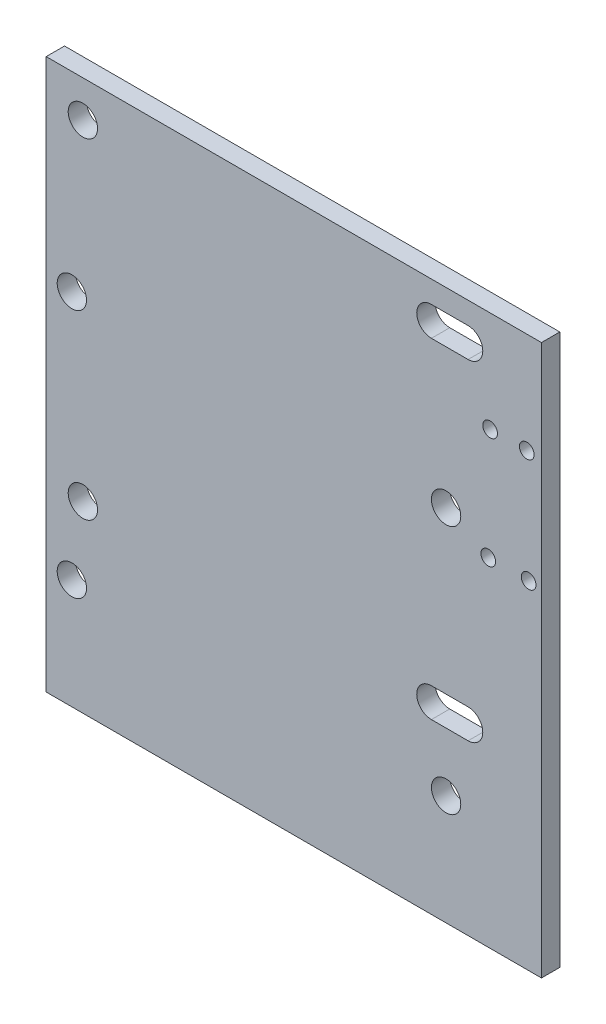
ISO-10303-21;
HEADER;
FILE_DESCRIPTION(('STEP AP214'),'2;1');
FILE_NAME('part.step','',(''),(''),'','','');
FILE_SCHEMA(('AUTOMOTIVE_DESIGN { 1 0 10303 214 1 1 1 1 }'));
ENDSEC;
DATA;
#1=APPLICATION_CONTEXT('core data for automotive mechanical design processes');
#2=APPLICATION_PROTOCOL_DEFINITION('international standard','automotive_design',2000,#1);
#3=PRODUCT_CONTEXT('',#1,'mechanical');
#4=PRODUCT('Part','Part','',(#3));
#5=PRODUCT_RELATED_PRODUCT_CATEGORY('part','',(#4));
#6=PRODUCT_DEFINITION_FORMATION('','',#4);
#7=PRODUCT_DEFINITION_CONTEXT('part definition',#1,'design');
#8=PRODUCT_DEFINITION('design','',#6,#7);
#9=PRODUCT_DEFINITION_SHAPE('','',#8);
#10=(LENGTH_UNIT() NAMED_UNIT(*) SI_UNIT(.MILLI.,.METRE.));
#11=(NAMED_UNIT(*) PLANE_ANGLE_UNIT() SI_UNIT($,.RADIAN.));
#12=(NAMED_UNIT(*) SI_UNIT($,.STERADIAN.) SOLID_ANGLE_UNIT());
#13=UNCERTAINTY_MEASURE_WITH_UNIT(LENGTH_MEASURE(1.E-05),#10,'distance_accuracy_value','');
#14=(GEOMETRIC_REPRESENTATION_CONTEXT(3) GLOBAL_UNCERTAINTY_ASSIGNED_CONTEXT((#13)) GLOBAL_UNIT_ASSIGNED_CONTEXT((#10,
#11,#12)) REPRESENTATION_CONTEXT('',''));
#15=CARTESIAN_POINT('',(0.,0.,0.));
#16=DIRECTION('',(0.,0.,1.));
#17=DIRECTION('',(1.,0.,0.));
#18=AXIS2_PLACEMENT_3D('',#15,#16,#17);
#19=CARTESIAN_POINT('',(67.5,75.,5.));
#20=DIRECTION('',(-1.,0.,0.));
#21=DIRECTION('',(0.,-1.,0.));
#22=AXIS2_PLACEMENT_3D('',#19,#20,#21);
#23=PLANE('',#22);
#24=DIRECTION('',(0.,1.,0.));
#25=VECTOR('',#24,1.);
#26=CARTESIAN_POINT('',(67.5,75.,0.));
#27=LINE('',#26,#25);
#28=CARTESIAN_POINT('',(67.5,-75.,0.));
#29=VERTEX_POINT('',#28);
#30=CARTESIAN_POINT('',(67.5,75.,0.));
#31=VERTEX_POINT('',#30);
#32=EDGE_CURVE('E200',#29,#31,#27,.T.);
#33=ORIENTED_EDGE('',*,*,#32,.T.);
#34=DIRECTION('',(0.,0.,-1.));
#35=VECTOR('',#34,1.);
#36=CARTESIAN_POINT('',(67.5,75.,5.));
#37=LINE('',#36,#35);
#38=CARTESIAN_POINT('',(67.5,75.,5.));
#39=VERTEX_POINT('',#38);
#40=EDGE_CURVE('E11',#39,#31,#37,.T.);
#41=ORIENTED_EDGE('',*,*,#40,.F.);
#42=DIRECTION('',(0.,1.,0.));
#43=VECTOR('',#42,1.);
#44=CARTESIAN_POINT('',(67.5,75.,5.));
#45=LINE('',#44,#43);
#46=CARTESIAN_POINT('',(67.5,-75.,5.));
#47=VERTEX_POINT('',#46);
#48=EDGE_CURVE('E201',#47,#39,#45,.T.);
#49=ORIENTED_EDGE('',*,*,#48,.F.);
#50=DIRECTION('',(0.,0.,-1.));
#51=VECTOR('',#50,1.);
#52=CARTESIAN_POINT('',(67.5,-75.,5.));
#53=LINE('',#52,#51);
#54=EDGE_CURVE('E211',#47,#29,#53,.T.);
#55=ORIENTED_EDGE('',*,*,#54,.T.);
#56=EDGE_LOOP('',(#33,#41,#49,#55));
#57=FACE_BOUND('',#56,.T.);
#58=ADVANCED_FACE('F35',(#57),#23,.F.);
#59=CARTESIAN_POINT('',(-67.5,75.,5.));
#60=DIRECTION('',(0.,-1.,0.));
#61=DIRECTION('',(0.,0.,-1.));
#62=AXIS2_PLACEMENT_3D('',#59,#60,#61);
#63=PLANE('',#62);
#64=DIRECTION('',(-1.,0.,0.));
#65=VECTOR('',#64,1.);
#66=CARTESIAN_POINT('',(-67.5,75.,0.));
#67=LINE('',#66,#65);
#68=CARTESIAN_POINT('',(-67.5,75.,0.));
#69=VERTEX_POINT('',#68);
#70=EDGE_CURVE('E214',#31,#69,#67,.T.);
#71=ORIENTED_EDGE('',*,*,#70,.T.);
#72=DIRECTION('',(0.,0.,-1.));
#73=VECTOR('',#72,1.);
#74=CARTESIAN_POINT('',(-67.5,75.,5.));
#75=LINE('',#74,#73);
#76=CARTESIAN_POINT('',(-67.5,75.,5.));
#77=VERTEX_POINT('',#76);
#78=EDGE_CURVE('E42',#77,#69,#75,.T.);
#79=ORIENTED_EDGE('',*,*,#78,.F.);
#80=DIRECTION('',(-1.,0.,0.));
#81=VECTOR('',#80,1.);
#82=CARTESIAN_POINT('',(-67.5,75.,5.));
#83=LINE('',#82,#81);
#84=EDGE_CURVE('E204',#39,#77,#83,.T.);
#85=ORIENTED_EDGE('',*,*,#84,.F.);
#86=ORIENTED_EDGE('',*,*,#40,.T.);
#87=EDGE_LOOP('',(#71,#79,#85,#86));
#88=FACE_BOUND('',#87,.T.);
#89=ADVANCED_FACE('F243',(#88),#63,.F.);
#90=CARTESIAN_POINT('',(-67.5,75.,5.));
#91=DIRECTION('',(1.,0.,0.));
#92=DIRECTION('',(0.,1.,0.));
#93=AXIS2_PLACEMENT_3D('',#90,#91,#92);
#94=PLANE('',#93);
#95=DIRECTION('',(0.,-1.,0.));
#96=VECTOR('',#95,1.);
#97=CARTESIAN_POINT('',(-67.5,75.,0.));
#98=LINE('',#97,#96);
#99=CARTESIAN_POINT('',(-67.5,-75.,0.));
#100=VERTEX_POINT('',#99);
#101=EDGE_CURVE('E216',#69,#100,#98,.T.);
#102=ORIENTED_EDGE('',*,*,#101,.T.);
#103=DIRECTION('',(0.,0.,-1.));
#104=VECTOR('',#103,1.);
#105=CARTESIAN_POINT('',(-67.5,-75.,5.));
#106=LINE('',#105,#104);
#107=CARTESIAN_POINT('',(-67.5,-75.,5.));
#108=VERTEX_POINT('',#107);
#109=EDGE_CURVE('E221',#108,#100,#106,.T.);
#110=ORIENTED_EDGE('',*,*,#109,.F.);
#111=DIRECTION('',(0.,-1.,0.));
#112=VECTOR('',#111,1.);
#113=CARTESIAN_POINT('',(-67.5,75.,5.));
#114=LINE('',#113,#112);
#115=EDGE_CURVE('E207',#77,#108,#114,.T.);
#116=ORIENTED_EDGE('',*,*,#115,.F.);
#117=ORIENTED_EDGE('',*,*,#78,.T.);
#118=EDGE_LOOP('',(#102,#110,#116,#117));
#119=FACE_BOUND('',#118,.T.);
#120=ADVANCED_FACE('F228',(#119),#94,.F.);
#121=CARTESIAN_POINT('',(-67.5,-75.,5.));
#122=DIRECTION('',(0.,1.,0.));
#123=DIRECTION('',(0.,0.,1.));
#124=AXIS2_PLACEMENT_3D('',#121,#122,#123);
#125=PLANE('',#124);
#126=DIRECTION('',(1.,0.,0.));
#127=VECTOR('',#126,1.);
#128=CARTESIAN_POINT('',(-67.5,-75.,0.));
#129=LINE('',#128,#127);
#130=EDGE_CURVE('E205',#100,#29,#129,.T.);
#131=ORIENTED_EDGE('',*,*,#130,.T.);
#132=ORIENTED_EDGE('',*,*,#54,.F.);
#133=DIRECTION('',(1.,0.,0.));
#134=VECTOR('',#133,1.);
#135=CARTESIAN_POINT('',(-67.5,-75.,5.));
#136=LINE('',#135,#134);
#137=EDGE_CURVE('E209',#108,#47,#136,.T.);
#138=ORIENTED_EDGE('',*,*,#137,.F.);
#139=ORIENTED_EDGE('',*,*,#109,.T.);
#140=EDGE_LOOP('',(#131,#132,#138,#139));
#141=FACE_BOUND('',#140,.T.);
#142=ADVANCED_FACE('F236',(#141),#125,.F.);
#143=CARTESIAN_POINT('',(0.,0.,5.));
#144=DIRECTION('',(0.,0.,1.));
#145=DIRECTION('',(1.,0.,0.));
#146=AXIS2_PLACEMENT_3D('',#143,#144,#145);
#147=PLANE('',#146);
#148=CARTESIAN_POINT('',(53.5,47.5,5.));
#149=DIRECTION('',(0.,0.,1.));
#150=DIRECTION('',(1.,0.,0.));
#151=AXIS2_PLACEMENT_3D('',#148,#149,#150);
#152=CIRCLE('',#151,2.);
#153=CARTESIAN_POINT('',(55.5,47.5,5.));
#154=VERTEX_POINT('',#153);
#155=EDGE_CURVE('E330',#154,#154,#152,.F.);
#156=ORIENTED_EDGE('',*,*,#155,.T.);
#157=EDGE_LOOP('',(#156));
#158=FACE_BOUND('',#157,.T.);
#159=CARTESIAN_POINT('',(64.,17.,5.));
#160=DIRECTION('',(0.,0.,1.));
#161=DIRECTION('',(1.,0.,0.));
#162=AXIS2_PLACEMENT_3D('',#159,#160,#161);
#163=CIRCLE('',#162,2.);
#164=CARTESIAN_POINT('',(66.,17.,5.));
#165=VERTEX_POINT('',#164);
#166=EDGE_CURVE('E344',#165,#165,#163,.F.);
#167=ORIENTED_EDGE('',*,*,#166,.T.);
#168=EDGE_LOOP('',(#167));
#169=FACE_BOUND('',#168,.T.);
#170=CARTESIAN_POINT('',(53.,17.,5.));
#171=DIRECTION('',(0.,0.,1.));
#172=DIRECTION('',(1.,0.,0.));
#173=AXIS2_PLACEMENT_3D('',#170,#171,#172);
#174=CIRCLE('',#173,2.);
#175=CARTESIAN_POINT('',(55.,17.,5.));
#176=VERTEX_POINT('',#175);
#177=EDGE_CURVE('E350',#176,#176,#174,.F.);
#178=ORIENTED_EDGE('',*,*,#177,.T.);
#179=EDGE_LOOP('',(#178));
#180=FACE_BOUND('',#179,.T.);
#181=CARTESIAN_POINT('',(63.5,47.5,5.));
#182=DIRECTION('',(0.,0.,1.));
#183=DIRECTION('',(1.,0.,0.));
#184=AXIS2_PLACEMENT_3D('',#181,#182,#183);
#185=CIRCLE('',#184,2.);
#186=CARTESIAN_POINT('',(65.5,47.5,5.));
#187=VERTEX_POINT('',#186);
#188=EDGE_CURVE('E334',#187,#187,#185,.F.);
#189=ORIENTED_EDGE('',*,*,#188,.T.);
#190=EDGE_LOOP('',(#189));
#191=FACE_BOUND('',#190,.T.);
#192=CARTESIAN_POINT('',(-60.5,-45.,5.));
#193=DIRECTION('',(0.,0.,1.));
#194=DIRECTION('',(1.,0.,0.));
#195=AXIS2_PLACEMENT_3D('',#192,#193,#194);
#196=CIRCLE('',#195,4.00000000000001);
#197=CARTESIAN_POINT('',(-56.5,-45.,5.));
#198=VERTEX_POINT('',#197);
#199=EDGE_CURVE('E356',#198,#198,#196,.T.);
#200=ORIENTED_EDGE('',*,*,#199,.F.);
#201=EDGE_LOOP('',(#200));
#202=FACE_BOUND('',#201,.T.);
#203=CARTESIAN_POINT('',(41.5,23.,5.));
#204=DIRECTION('',(0.,0.,1.));
#205=DIRECTION('',(1.,0.,0.));
#206=AXIS2_PLACEMENT_3D('',#203,#204,#205);
#207=CIRCLE('',#206,4.);
#208=CARTESIAN_POINT('',(45.5,23.,5.));
#209=VERTEX_POINT('',#208);
#210=EDGE_CURVE('E364',#209,#209,#207,.T.);
#211=ORIENTED_EDGE('',*,*,#210,.F.);
#212=EDGE_LOOP('',(#211));
#213=FACE_BOUND('',#212,.T.);
#214=CARTESIAN_POINT('',(41.5,-45.,5.));
#215=DIRECTION('',(0.,0.,1.));
#216=DIRECTION('',(1.,0.,0.));
#217=AXIS2_PLACEMENT_3D('',#214,#215,#216);
#218=CIRCLE('',#217,4.);
#219=CARTESIAN_POINT('',(45.5,-45.,5.));
#220=VERTEX_POINT('',#219);
#221=EDGE_CURVE('E354',#220,#220,#218,.T.);
#222=ORIENTED_EDGE('',*,*,#221,.F.);
#223=EDGE_LOOP('',(#222));
#224=FACE_BOUND('',#223,.T.);
#225=CARTESIAN_POINT('',(-60.5,23.,5.));
#226=DIRECTION('',(0.,0.,1.));
#227=DIRECTION('',(1.,0.,0.));
#228=AXIS2_PLACEMENT_3D('',#225,#226,#227);
#229=CIRCLE('',#228,4.00000000000001);
#230=CARTESIAN_POINT('',(-56.5,23.,5.));
#231=VERTEX_POINT('',#230);
#232=EDGE_CURVE('E363',#231,#231,#229,.T.);
#233=ORIENTED_EDGE('',*,*,#232,.F.);
#234=EDGE_LOOP('',(#233));
#235=FACE_BOUND('',#234,.T.);
#236=CARTESIAN_POINT('',(-57.5,-25.,5.));
#237=DIRECTION('',(0.,0.,1.));
#238=DIRECTION('',(-1.,0.,0.));
#239=AXIS2_PLACEMENT_3D('',#236,#237,#238);
#240=CIRCLE('',#239,4.00000000000001);
#241=CARTESIAN_POINT('',(-61.5,-25.,5.));
#242=VERTEX_POINT('',#241);
#243=EDGE_CURVE('E139',#242,#242,#240,.T.);
#244=ORIENTED_EDGE('',*,*,#243,.F.);
#245=EDGE_LOOP('',(#244));
#246=FACE_BOUND('',#245,.T.);
#247=CARTESIAN_POINT('',(37.5,65.,5.));
#248=DIRECTION('',(0.,0.,1.));
#249=DIRECTION('',(1.,0.,0.));
#250=AXIS2_PLACEMENT_3D('',#247,#248,#249);
#251=CIRCLE('',#250,4.);
#252=CARTESIAN_POINT('',(37.5,69.,5.));
#253=VERTEX_POINT('',#252);
#254=CARTESIAN_POINT('',(37.5,61.,5.));
#255=VERTEX_POINT('',#254);
#256=EDGE_CURVE('E49',#253,#255,#251,.T.);
#257=ORIENTED_EDGE('',*,*,#256,.F.);
#258=DIRECTION('',(-1.,0.,0.));
#259=VECTOR('',#258,1.);
#260=CARTESIAN_POINT('',(37.5,69.,5.));
#261=LINE('',#260,#259);
#262=CARTESIAN_POINT('',(47.5,69.,5.));
#263=VERTEX_POINT('',#262);
#264=EDGE_CURVE('E131',#263,#253,#261,.T.);
#265=ORIENTED_EDGE('',*,*,#264,.F.);
#266=CARTESIAN_POINT('',(47.5,65.,5.));
#267=DIRECTION('',(0.,0.,1.));
#268=DIRECTION('',(1.,0.,0.));
#269=AXIS2_PLACEMENT_3D('',#266,#267,#268);
#270=CIRCLE('',#269,4.);
#271=CARTESIAN_POINT('',(47.5,61.,5.));
#272=VERTEX_POINT('',#271);
#273=EDGE_CURVE('E154',#272,#263,#270,.T.);
#274=ORIENTED_EDGE('',*,*,#273,.F.);
#275=DIRECTION('',(1.,0.,0.));
#276=VECTOR('',#275,1.);
#277=CARTESIAN_POINT('',(37.5,61.,5.));
#278=LINE('',#277,#276);
#279=EDGE_CURVE('E147',#255,#272,#278,.T.);
#280=ORIENTED_EDGE('',*,*,#279,.F.);
#281=EDGE_LOOP('',(#257,#265,#274,#280));
#282=FACE_BOUND('',#281,.T.);
#283=CARTESIAN_POINT('',(37.5,-25.,5.));
#284=DIRECTION('',(0.,0.,1.));
#285=DIRECTION('',(-1.,0.,0.));
#286=AXIS2_PLACEMENT_3D('',#283,#284,#285);
#287=CIRCLE('',#286,4.00000000000001);
#288=CARTESIAN_POINT('',(37.5,-21.,5.));
#289=VERTEX_POINT('',#288);
#290=CARTESIAN_POINT('',(37.5,-29.,5.));
#291=VERTEX_POINT('',#290);
#292=EDGE_CURVE('E57',#289,#291,#287,.T.);
#293=ORIENTED_EDGE('',*,*,#292,.F.);
#294=DIRECTION('',(-1.,0.,0.));
#295=VECTOR('',#294,1.);
#296=CARTESIAN_POINT('',(37.5,-21.,5.));
#297=LINE('',#296,#295);
#298=CARTESIAN_POINT('',(47.5,-21.,5.));
#299=VERTEX_POINT('',#298);
#300=EDGE_CURVE('E179',#299,#289,#297,.T.);
#301=ORIENTED_EDGE('',*,*,#300,.F.);
#302=CARTESIAN_POINT('',(47.5,-25.,5.));
#303=DIRECTION('',(0.,0.,1.));
#304=DIRECTION('',(-1.,0.,0.));
#305=AXIS2_PLACEMENT_3D('',#302,#303,#304);
#306=CIRCLE('',#305,4.00000000000001);
#307=CARTESIAN_POINT('',(47.5,-29.,5.));
#308=VERTEX_POINT('',#307);
#309=EDGE_CURVE('E176',#308,#299,#306,.T.);
#310=ORIENTED_EDGE('',*,*,#309,.F.);
#311=DIRECTION('',(1.,0.,0.));
#312=VECTOR('',#311,1.);
#313=CARTESIAN_POINT('',(37.5,-29.,5.));
#314=LINE('',#313,#312);
#315=EDGE_CURVE('E173',#291,#308,#314,.T.);
#316=ORIENTED_EDGE('',*,*,#315,.F.);
#317=EDGE_LOOP('',(#293,#301,#310,#316));
#318=FACE_BOUND('',#317,.T.);
#319=CARTESIAN_POINT('',(-57.5,65.,5.));
#320=DIRECTION('',(0.,0.,1.));
#321=DIRECTION('',(1.,0.,0.));
#322=AXIS2_PLACEMENT_3D('',#319,#320,#321);
#323=CIRCLE('',#322,4.00000000000001);
#324=CARTESIAN_POINT('',(-53.5,65.,5.));
#325=VERTEX_POINT('',#324);
#326=EDGE_CURVE('E193',#325,#325,#323,.T.);
#327=ORIENTED_EDGE('',*,*,#326,.F.);
#328=EDGE_LOOP('',(#327));
#329=FACE_BOUND('',#328,.T.);
#330=ORIENTED_EDGE('',*,*,#48,.T.);
#331=ORIENTED_EDGE('',*,*,#84,.T.);
#332=ORIENTED_EDGE('',*,*,#115,.T.);
#333=ORIENTED_EDGE('',*,*,#137,.T.);
#334=EDGE_LOOP('',(#330,#331,#332,#333));
#335=FACE_BOUND('',#334,.T.);
#336=ADVANCED_FACE('F242',(#158,#169,#180,#191,#202,#213,#224,#235,#246,#282,#318,#329,#335),
#147,.T.);
#337=CARTESIAN_POINT('',(0.,0.,0.));
#338=DIRECTION('',(0.,0.,1.));
#339=DIRECTION('',(1.,0.,0.));
#340=AXIS2_PLACEMENT_3D('',#337,#338,#339);
#341=PLANE('',#340);
#342=CARTESIAN_POINT('',(53.5,47.5,0.));
#343=DIRECTION('',(0.,0.,-1.));
#344=DIRECTION('',(-1.,0.,0.));
#345=AXIS2_PLACEMENT_3D('',#342,#343,#344);
#346=CIRCLE('',#345,2.);
#347=CARTESIAN_POINT('',(51.5,47.5,0.));
#348=VERTEX_POINT('',#347);
#349=EDGE_CURVE('E333',#348,#348,#346,.T.);
#350=ORIENTED_EDGE('',*,*,#349,.F.);
#351=EDGE_LOOP('',(#350));
#352=FACE_BOUND('',#351,.T.);
#353=CARTESIAN_POINT('',(64.,17.,0.));
#354=DIRECTION('',(0.,0.,-1.));
#355=DIRECTION('',(-1.,0.,0.));
#356=AXIS2_PLACEMENT_3D('',#353,#354,#355);
#357=CIRCLE('',#356,2.);
#358=CARTESIAN_POINT('',(62.,17.,0.));
#359=VERTEX_POINT('',#358);
#360=EDGE_CURVE('E339',#359,#359,#357,.T.);
#361=ORIENTED_EDGE('',*,*,#360,.F.);
#362=EDGE_LOOP('',(#361));
#363=FACE_BOUND('',#362,.T.);
#364=CARTESIAN_POINT('',(53.,17.,0.));
#365=DIRECTION('',(0.,0.,-1.));
#366=DIRECTION('',(-1.,0.,0.));
#367=AXIS2_PLACEMENT_3D('',#364,#365,#366);
#368=CIRCLE('',#367,2.);
#369=CARTESIAN_POINT('',(51.,17.,0.));
#370=VERTEX_POINT('',#369);
#371=EDGE_CURVE('E347',#370,#370,#368,.T.);
#372=ORIENTED_EDGE('',*,*,#371,.F.);
#373=EDGE_LOOP('',(#372));
#374=FACE_BOUND('',#373,.T.);
#375=CARTESIAN_POINT('',(63.5,47.5,0.));
#376=DIRECTION('',(0.,0.,-1.));
#377=DIRECTION('',(-1.,0.,0.));
#378=AXIS2_PLACEMENT_3D('',#375,#376,#377);
#379=CIRCLE('',#378,2.);
#380=CARTESIAN_POINT('',(61.5,47.5,0.));
#381=VERTEX_POINT('',#380);
#382=EDGE_CURVE('E337',#381,#381,#379,.T.);
#383=ORIENTED_EDGE('',*,*,#382,.F.);
#384=EDGE_LOOP('',(#383));
#385=FACE_BOUND('',#384,.T.);
#386=CARTESIAN_POINT('',(-60.5,-45.,0.));
#387=DIRECTION('',(0.,0.,1.));
#388=DIRECTION('',(1.,0.,0.));
#389=AXIS2_PLACEMENT_3D('',#386,#387,#388);
#390=CIRCLE('',#389,4.00000000000001);
#391=CARTESIAN_POINT('',(-56.5,-45.,0.));
#392=VERTEX_POINT('',#391);
#393=EDGE_CURVE('E359',#392,#392,#390,.F.);
#394=ORIENTED_EDGE('',*,*,#393,.F.);
#395=EDGE_LOOP('',(#394));
#396=FACE_BOUND('',#395,.T.);
#397=CARTESIAN_POINT('',(41.5,23.,0.));
#398=DIRECTION('',(0.,0.,1.));
#399=DIRECTION('',(1.,0.,0.));
#400=AXIS2_PLACEMENT_3D('',#397,#398,#399);
#401=CIRCLE('',#400,4.);
#402=CARTESIAN_POINT('',(45.5,23.,0.));
#403=VERTEX_POINT('',#402);
#404=EDGE_CURVE('E360',#403,#403,#401,.F.);
#405=ORIENTED_EDGE('',*,*,#404,.F.);
#406=EDGE_LOOP('',(#405));
#407=FACE_BOUND('',#406,.T.);
#408=CARTESIAN_POINT('',(41.5,-45.,0.));
#409=DIRECTION('',(0.,0.,1.));
#410=DIRECTION('',(1.,0.,0.));
#411=AXIS2_PLACEMENT_3D('',#408,#409,#410);
#412=CIRCLE('',#411,4.);
#413=CARTESIAN_POINT('',(45.5,-45.,0.));
#414=VERTEX_POINT('',#413);
#415=EDGE_CURVE('E367',#414,#414,#412,.F.);
#416=ORIENTED_EDGE('',*,*,#415,.F.);
#417=EDGE_LOOP('',(#416));
#418=FACE_BOUND('',#417,.T.);
#419=CARTESIAN_POINT('',(-60.5,23.,0.));
#420=DIRECTION('',(0.,0.,1.));
#421=DIRECTION('',(1.,0.,0.));
#422=AXIS2_PLACEMENT_3D('',#419,#420,#421);
#423=CIRCLE('',#422,4.00000000000001);
#424=CARTESIAN_POINT('',(-56.5,23.,0.));
#425=VERTEX_POINT('',#424);
#426=EDGE_CURVE('E166',#425,#425,#423,.F.);
#427=ORIENTED_EDGE('',*,*,#426,.F.);
#428=EDGE_LOOP('',(#427));
#429=FACE_BOUND('',#428,.T.);
#430=CARTESIAN_POINT('',(-57.5,-25.,0.));
#431=DIRECTION('',(0.,0.,1.));
#432=DIRECTION('',(1.,0.,0.));
#433=AXIS2_PLACEMENT_3D('',#430,#431,#432);
#434=CIRCLE('',#433,4.00000000000001);
#435=CARTESIAN_POINT('',(-53.5,-25.,0.));
#436=VERTEX_POINT('',#435);
#437=EDGE_CURVE('E197',#436,#436,#434,.F.);
#438=ORIENTED_EDGE('',*,*,#437,.F.);
#439=EDGE_LOOP('',(#438));
#440=FACE_BOUND('',#439,.T.);
#441=DIRECTION('',(1.,0.,0.));
#442=VECTOR('',#441,1.);
#443=CARTESIAN_POINT('',(37.5,69.,0.));
#444=LINE('',#443,#442);
#445=CARTESIAN_POINT('',(37.5,69.,0.));
#446=VERTEX_POINT('',#445);
#447=CARTESIAN_POINT('',(47.5,69.,0.));
#448=VERTEX_POINT('',#447);
#449=EDGE_CURVE('E145',#446,#448,#444,.T.);
#450=ORIENTED_EDGE('',*,*,#449,.F.);
#451=CARTESIAN_POINT('',(37.5,65.,0.));
#452=DIRECTION('',(0.,0.,1.));
#453=DIRECTION('',(1.,0.,0.));
#454=AXIS2_PLACEMENT_3D('',#451,#452,#453);
#455=CIRCLE('',#454,4.);
#456=CARTESIAN_POINT('',(37.5,61.,0.));
#457=VERTEX_POINT('',#456);
#458=EDGE_CURVE('E125',#457,#446,#455,.F.);
#459=ORIENTED_EDGE('',*,*,#458,.F.);
#460=DIRECTION('',(-1.,0.,0.));
#461=VECTOR('',#460,1.);
#462=CARTESIAN_POINT('',(37.5,61.,0.));
#463=LINE('',#462,#461);
#464=CARTESIAN_POINT('',(47.5,61.,0.));
#465=VERTEX_POINT('',#464);
#466=EDGE_CURVE('E135',#465,#457,#463,.T.);
#467=ORIENTED_EDGE('',*,*,#466,.F.);
#468=CARTESIAN_POINT('',(47.5,65.,0.));
#469=DIRECTION('',(0.,0.,1.));
#470=DIRECTION('',(1.,0.,0.));
#471=AXIS2_PLACEMENT_3D('',#468,#469,#470);
#472=CIRCLE('',#471,4.);
#473=EDGE_CURVE('E149',#448,#465,#472,.F.);
#474=ORIENTED_EDGE('',*,*,#473,.F.);
#475=EDGE_LOOP('',(#450,#459,#467,#474));
#476=FACE_BOUND('',#475,.T.);
#477=DIRECTION('',(1.,0.,0.));
#478=VECTOR('',#477,1.);
#479=CARTESIAN_POINT('',(37.5,-21.,0.));
#480=LINE('',#479,#478);
#481=CARTESIAN_POINT('',(37.5,-21.,0.));
#482=VERTEX_POINT('',#481);
#483=CARTESIAN_POINT('',(47.5,-21.,0.));
#484=VERTEX_POINT('',#483);
#485=EDGE_CURVE('E165',#482,#484,#480,.T.);
#486=ORIENTED_EDGE('',*,*,#485,.F.);
#487=CARTESIAN_POINT('',(37.5,-25.,0.));
#488=DIRECTION('',(0.,0.,1.));
#489=DIRECTION('',(1.,0.,0.));
#490=AXIS2_PLACEMENT_3D('',#487,#488,#489);
#491=CIRCLE('',#490,4.00000000000001);
#492=CARTESIAN_POINT('',(37.5,-29.,0.));
#493=VERTEX_POINT('',#492);
#494=EDGE_CURVE('E169',#493,#482,#491,.F.);
#495=ORIENTED_EDGE('',*,*,#494,.F.);
#496=DIRECTION('',(-1.,0.,0.));
#497=VECTOR('',#496,1.);
#498=CARTESIAN_POINT('',(37.5,-29.,0.));
#499=LINE('',#498,#497);
#500=CARTESIAN_POINT('',(47.5,-29.,0.));
#501=VERTEX_POINT('',#500);
#502=EDGE_CURVE('E185',#501,#493,#499,.T.);
#503=ORIENTED_EDGE('',*,*,#502,.F.);
#504=CARTESIAN_POINT('',(47.5,-25.,0.));
#505=DIRECTION('',(0.,0.,1.));
#506=DIRECTION('',(1.,0.,0.));
#507=AXIS2_PLACEMENT_3D('',#504,#505,#506);
#508=CIRCLE('',#507,4.00000000000001);
#509=EDGE_CURVE('E163',#484,#501,#508,.F.);
#510=ORIENTED_EDGE('',*,*,#509,.F.);
#511=EDGE_LOOP('',(#486,#495,#503,#510));
#512=FACE_BOUND('',#511,.T.);
#513=CARTESIAN_POINT('',(-57.5,65.,0.));
#514=DIRECTION('',(0.,0.,1.));
#515=DIRECTION('',(1.,0.,0.));
#516=AXIS2_PLACEMENT_3D('',#513,#514,#515);
#517=CIRCLE('',#516,4.00000000000001);
#518=CARTESIAN_POINT('',(-53.5,65.,0.));
#519=VERTEX_POINT('',#518);
#520=EDGE_CURVE('E196',#519,#519,#517,.F.);
#521=ORIENTED_EDGE('',*,*,#520,.F.);
#522=EDGE_LOOP('',(#521));
#523=FACE_BOUND('',#522,.T.);
#524=ORIENTED_EDGE('',*,*,#32,.F.);
#525=ORIENTED_EDGE('',*,*,#130,.F.);
#526=ORIENTED_EDGE('',*,*,#101,.F.);
#527=ORIENTED_EDGE('',*,*,#70,.F.);
#528=EDGE_LOOP('',(#524,#525,#526,#527));
#529=FACE_BOUND('',#528,.T.);
#530=ADVANCED_FACE('F142',(#352,#363,#374,#385,#396,#407,#418,#429,#440,#476,#512,#523,#529),
#341,.F.);
#531=CARTESIAN_POINT('',(-57.5,65.,-0.00100000000000013));
#532=DIRECTION('',(0.,0.,1.));
#533=DIRECTION('',(1.,0.,0.));
#534=AXIS2_PLACEMENT_3D('',#531,#532,#533);
#535=CYLINDRICAL_SURFACE('',#534,4.00000000000001);
#536=ORIENTED_EDGE('',*,*,#326,.T.);
#537=EDGE_LOOP('',(#536));
#538=FACE_BOUND('',#537,.T.);
#539=ORIENTED_EDGE('',*,*,#520,.T.);
#540=EDGE_LOOP('',(#539));
#541=FACE_BOUND('',#540,.T.);
#542=ADVANCED_FACE('F255',(#538,#541),#535,.F.);
#543=CARTESIAN_POINT('',(37.5,-25.,-0.00100000000000013));
#544=DIRECTION('',(0.,0.,1.));
#545=DIRECTION('',(1.,0.,0.));
#546=AXIS2_PLACEMENT_3D('',#543,#544,#545);
#547=CYLINDRICAL_SURFACE('',#546,4.00000000000001);
#548=ORIENTED_EDGE('',*,*,#494,.T.);
#549=DIRECTION('',(0.,0.,1.));
#550=VECTOR('',#549,1.);
#551=CARTESIAN_POINT('',(37.5,-21.,-0.00100000000000013));
#552=LINE('',#551,#550);
#553=EDGE_CURVE('E183',#482,#289,#552,.T.);
#554=ORIENTED_EDGE('',*,*,#553,.T.);
#555=ORIENTED_EDGE('',*,*,#292,.T.);
#556=DIRECTION('',(0.,0.,1.));
#557=VECTOR('',#556,1.);
#558=CARTESIAN_POINT('',(37.5,-29.,-0.00100000000000013));
#559=LINE('',#558,#557);
#560=EDGE_CURVE('E182',#493,#291,#559,.T.);
#561=ORIENTED_EDGE('',*,*,#560,.F.);
#562=EDGE_LOOP('',(#548,#554,#555,#561));
#563=FACE_BOUND('',#562,.T.);
#564=ADVANCED_FACE('F262',(#563),#547,.F.);
#565=CARTESIAN_POINT('',(37.5,-21.,-0.00100000000000013));
#566=DIRECTION('',(0.,1.,0.));
#567=DIRECTION('',(-1.,0.,0.));
#568=AXIS2_PLACEMENT_3D('',#565,#566,#567);
#569=PLANE('',#568);
#570=ORIENTED_EDGE('',*,*,#485,.T.);
#571=DIRECTION('',(0.,0.,1.));
#572=VECTOR('',#571,1.);
#573=CARTESIAN_POINT('',(47.5,-21.,-0.00100000000000013));
#574=LINE('',#573,#572);
#575=EDGE_CURVE('E186',#484,#299,#574,.T.);
#576=ORIENTED_EDGE('',*,*,#575,.T.);
#577=ORIENTED_EDGE('',*,*,#300,.T.);
#578=ORIENTED_EDGE('',*,*,#553,.F.);
#579=EDGE_LOOP('',(#570,#576,#577,#578));
#580=FACE_BOUND('',#579,.T.);
#581=ADVANCED_FACE('F266',(#580),#569,.F.);
#582=CARTESIAN_POINT('',(47.5,-25.,-0.00100000000000013));
#583=DIRECTION('',(0.,0.,1.));
#584=DIRECTION('',(1.,0.,0.));
#585=AXIS2_PLACEMENT_3D('',#582,#583,#584);
#586=CYLINDRICAL_SURFACE('',#585,4.00000000000001);
#587=ORIENTED_EDGE('',*,*,#509,.T.);
#588=DIRECTION('',(0.,0.,1.));
#589=VECTOR('',#588,1.);
#590=CARTESIAN_POINT('',(47.5,-29.,-0.00100000000000013));
#591=LINE('',#590,#589);
#592=EDGE_CURVE('E188',#501,#308,#591,.T.);
#593=ORIENTED_EDGE('',*,*,#592,.T.);
#594=ORIENTED_EDGE('',*,*,#309,.T.);
#595=ORIENTED_EDGE('',*,*,#575,.F.);
#596=EDGE_LOOP('',(#587,#593,#594,#595));
#597=FACE_BOUND('',#596,.T.);
#598=ADVANCED_FACE('F270',(#597),#586,.F.);
#599=CARTESIAN_POINT('',(37.5,-29.,-0.00100000000000013));
#600=DIRECTION('',(0.,-1.,0.));
#601=DIRECTION('',(1.,0.,0.));
#602=AXIS2_PLACEMENT_3D('',#599,#600,#601);
#603=PLANE('',#602);
#604=ORIENTED_EDGE('',*,*,#502,.T.);
#605=ORIENTED_EDGE('',*,*,#560,.T.);
#606=ORIENTED_EDGE('',*,*,#315,.T.);
#607=ORIENTED_EDGE('',*,*,#592,.F.);
#608=EDGE_LOOP('',(#604,#605,#606,#607));
#609=FACE_BOUND('',#608,.T.);
#610=ADVANCED_FACE('F267',(#609),#603,.F.);
#611=CARTESIAN_POINT('',(37.5,65.,-0.00100000000000013));
#612=DIRECTION('',(0.,0.,1.));
#613=DIRECTION('',(1.,0.,0.));
#614=AXIS2_PLACEMENT_3D('',#611,#612,#613);
#615=CYLINDRICAL_SURFACE('',#614,4.);
#616=ORIENTED_EDGE('',*,*,#458,.T.);
#617=DIRECTION('',(0.,0.,1.));
#618=VECTOR('',#617,1.);
#619=CARTESIAN_POINT('',(37.5,69.,-0.00100000000000013));
#620=LINE('',#619,#618);
#621=EDGE_CURVE('E140',#446,#253,#620,.T.);
#622=ORIENTED_EDGE('',*,*,#621,.T.);
#623=ORIENTED_EDGE('',*,*,#256,.T.);
#624=DIRECTION('',(0.,0.,1.));
#625=VECTOR('',#624,1.);
#626=CARTESIAN_POINT('',(37.5,61.,-0.00100000000000013));
#627=LINE('',#626,#625);
#628=EDGE_CURVE('E121',#457,#255,#627,.T.);
#629=ORIENTED_EDGE('',*,*,#628,.F.);
#630=EDGE_LOOP('',(#616,#622,#623,#629));
#631=FACE_BOUND('',#630,.T.);
#632=ADVANCED_FACE('F123',(#631),#615,.F.);
#633=CARTESIAN_POINT('',(37.5,69.,-0.00100000000000013));
#634=DIRECTION('',(0.,1.,0.));
#635=DIRECTION('',(0.,0.,1.));
#636=AXIS2_PLACEMENT_3D('',#633,#634,#635);
#637=PLANE('',#636);
#638=ORIENTED_EDGE('',*,*,#449,.T.);
#639=DIRECTION('',(0.,0.,1.));
#640=VECTOR('',#639,1.);
#641=CARTESIAN_POINT('',(47.5,69.,-0.00100000000000013));
#642=LINE('',#641,#640);
#643=EDGE_CURVE('E160',#448,#263,#642,.T.);
#644=ORIENTED_EDGE('',*,*,#643,.T.);
#645=ORIENTED_EDGE('',*,*,#264,.T.);
#646=ORIENTED_EDGE('',*,*,#621,.F.);
#647=EDGE_LOOP('',(#638,#644,#645,#646));
#648=FACE_BOUND('',#647,.T.);
#649=ADVANCED_FACE('F280',(#648),#637,.F.);
#650=CARTESIAN_POINT('',(47.5,65.,-0.00100000000000013));
#651=DIRECTION('',(0.,0.,1.));
#652=DIRECTION('',(1.,0.,0.));
#653=AXIS2_PLACEMENT_3D('',#650,#651,#652);
#654=CYLINDRICAL_SURFACE('',#653,4.);
#655=ORIENTED_EDGE('',*,*,#473,.T.);
#656=DIRECTION('',(0.,0.,1.));
#657=VECTOR('',#656,1.);
#658=CARTESIAN_POINT('',(47.5,61.,-0.00100000000000013));
#659=LINE('',#658,#657);
#660=EDGE_CURVE('E130',#465,#272,#659,.T.);
#661=ORIENTED_EDGE('',*,*,#660,.T.);
#662=ORIENTED_EDGE('',*,*,#273,.T.);
#663=ORIENTED_EDGE('',*,*,#643,.F.);
#664=EDGE_LOOP('',(#655,#661,#662,#663));
#665=FACE_BOUND('',#664,.T.);
#666=ADVANCED_FACE('F284',(#665),#654,.F.);
#667=CARTESIAN_POINT('',(37.5,61.,-0.00100000000000013));
#668=DIRECTION('',(0.,-1.,0.));
#669=DIRECTION('',(0.,0.,-1.));
#670=AXIS2_PLACEMENT_3D('',#667,#668,#669);
#671=PLANE('',#670);
#672=ORIENTED_EDGE('',*,*,#466,.T.);
#673=ORIENTED_EDGE('',*,*,#628,.T.);
#674=ORIENTED_EDGE('',*,*,#279,.T.);
#675=ORIENTED_EDGE('',*,*,#660,.F.);
#676=EDGE_LOOP('',(#672,#673,#674,#675));
#677=FACE_BOUND('',#676,.T.);
#678=ADVANCED_FACE('F136',(#677),#671,.F.);
#679=CARTESIAN_POINT('',(-57.5,-25.,-0.00100000000000013));
#680=DIRECTION('',(0.,0.,1.));
#681=DIRECTION('',(1.,0.,0.));
#682=AXIS2_PLACEMENT_3D('',#679,#680,#681);
#683=CYLINDRICAL_SURFACE('',#682,4.00000000000001);
#684=ORIENTED_EDGE('',*,*,#243,.T.);
#685=EDGE_LOOP('',(#684));
#686=FACE_BOUND('',#685,.T.);
#687=ORIENTED_EDGE('',*,*,#437,.T.);
#688=EDGE_LOOP('',(#687));
#689=FACE_BOUND('',#688,.T.);
#690=ADVANCED_FACE('F283',(#686,#689),#683,.F.);
#691=CARTESIAN_POINT('',(-60.5,23.,-0.00100000000000013));
#692=DIRECTION('',(0.,0.,1.));
#693=DIRECTION('',(1.,0.,0.));
#694=AXIS2_PLACEMENT_3D('',#691,#692,#693);
#695=CYLINDRICAL_SURFACE('',#694,4.00000000000001);
#696=ORIENTED_EDGE('',*,*,#232,.T.);
#697=EDGE_LOOP('',(#696));
#698=FACE_BOUND('',#697,.T.);
#699=ORIENTED_EDGE('',*,*,#426,.T.);
#700=EDGE_LOOP('',(#699));
#701=FACE_BOUND('',#700,.T.);
#702=ADVANCED_FACE('F293',(#698,#701),#695,.F.);
#703=CARTESIAN_POINT('',(41.5,-45.,-0.00100000000000013));
#704=DIRECTION('',(0.,0.,1.));
#705=DIRECTION('',(1.,0.,0.));
#706=AXIS2_PLACEMENT_3D('',#703,#704,#705);
#707=CYLINDRICAL_SURFACE('',#706,4.);
#708=ORIENTED_EDGE('',*,*,#221,.T.);
#709=EDGE_LOOP('',(#708));
#710=FACE_BOUND('',#709,.T.);
#711=ORIENTED_EDGE('',*,*,#415,.T.);
#712=EDGE_LOOP('',(#711));
#713=FACE_BOUND('',#712,.T.);
#714=ADVANCED_FACE('F297',(#710,#713),#707,.F.);
#715=CARTESIAN_POINT('',(41.5,23.,-0.00100000000000013));
#716=DIRECTION('',(0.,0.,1.));
#717=DIRECTION('',(1.,0.,0.));
#718=AXIS2_PLACEMENT_3D('',#715,#716,#717);
#719=CYLINDRICAL_SURFACE('',#718,4.);
#720=ORIENTED_EDGE('',*,*,#210,.T.);
#721=EDGE_LOOP('',(#720));
#722=FACE_BOUND('',#721,.T.);
#723=ORIENTED_EDGE('',*,*,#404,.T.);
#724=EDGE_LOOP('',(#723));
#725=FACE_BOUND('',#724,.T.);
#726=ADVANCED_FACE('F301',(#722,#725),#719,.F.);
#727=CARTESIAN_POINT('',(-60.5,-45.,-0.00100000000000013));
#728=DIRECTION('',(0.,0.,1.));
#729=DIRECTION('',(1.,0.,0.));
#730=AXIS2_PLACEMENT_3D('',#727,#728,#729);
#731=CYLINDRICAL_SURFACE('',#730,4.00000000000001);
#732=ORIENTED_EDGE('',*,*,#199,.T.);
#733=EDGE_LOOP('',(#732));
#734=FACE_BOUND('',#733,.T.);
#735=ORIENTED_EDGE('',*,*,#393,.T.);
#736=EDGE_LOOP('',(#735));
#737=FACE_BOUND('',#736,.T.);
#738=ADVANCED_FACE('F305',(#734,#737),#731,.F.);
#739=CARTESIAN_POINT('',(63.5,47.5,5.001));
#740=DIRECTION('',(0.,0.,-1.));
#741=DIRECTION('',(-1.,0.,0.));
#742=AXIS2_PLACEMENT_3D('',#739,#740,#741);
#743=CYLINDRICAL_SURFACE('',#742,2.);
#744=ORIENTED_EDGE('',*,*,#188,.F.);
#745=EDGE_LOOP('',(#744));
#746=FACE_BOUND('',#745,.T.);
#747=ORIENTED_EDGE('',*,*,#382,.T.);
#748=EDGE_LOOP('',(#747));
#749=FACE_BOUND('',#748,.T.);
#750=ADVANCED_FACE('F309',(#746,#749),#743,.F.);
#751=CARTESIAN_POINT('',(53.,17.,5.001));
#752=DIRECTION('',(0.,0.,-1.));
#753=DIRECTION('',(-1.,0.,0.));
#754=AXIS2_PLACEMENT_3D('',#751,#752,#753);
#755=CYLINDRICAL_SURFACE('',#754,2.);
#756=ORIENTED_EDGE('',*,*,#177,.F.);
#757=EDGE_LOOP('',(#756));
#758=FACE_BOUND('',#757,.T.);
#759=ORIENTED_EDGE('',*,*,#371,.T.);
#760=EDGE_LOOP('',(#759));
#761=FACE_BOUND('',#760,.T.);
#762=ADVANCED_FACE('F313',(#758,#761),#755,.F.);
#763=CARTESIAN_POINT('',(64.,17.,5.001));
#764=DIRECTION('',(0.,0.,-1.));
#765=DIRECTION('',(-1.,0.,0.));
#766=AXIS2_PLACEMENT_3D('',#763,#764,#765);
#767=CYLINDRICAL_SURFACE('',#766,2.);
#768=ORIENTED_EDGE('',*,*,#166,.F.);
#769=EDGE_LOOP('',(#768));
#770=FACE_BOUND('',#769,.T.);
#771=ORIENTED_EDGE('',*,*,#360,.T.);
#772=EDGE_LOOP('',(#771));
#773=FACE_BOUND('',#772,.T.);
#774=ADVANCED_FACE('F317',(#770,#773),#767,.F.);
#775=CARTESIAN_POINT('',(53.5,47.5,5.001));
#776=DIRECTION('',(0.,0.,-1.));
#777=DIRECTION('',(-1.,0.,0.));
#778=AXIS2_PLACEMENT_3D('',#775,#776,#777);
#779=CYLINDRICAL_SURFACE('',#778,2.);
#780=ORIENTED_EDGE('',*,*,#155,.F.);
#781=EDGE_LOOP('',(#780));
#782=FACE_BOUND('',#781,.T.);
#783=ORIENTED_EDGE('',*,*,#349,.T.);
#784=EDGE_LOOP('',(#783));
#785=FACE_BOUND('',#784,.T.);
#786=ADVANCED_FACE('F321',(#782,#785),#779,.F.);
#787=CLOSED_SHELL('',(#58,#89,#120,#142,#336,#530,#542,#564,#581,#598,#610,#632,#649,#666,#678,
#690,#702,#714,#726,#738,#750,#762,#774,#786));
#788=MANIFOLD_SOLID_BREP('B2',#787);
#789=ADVANCED_BREP_SHAPE_REPRESENTATION('',(#18,#788),#14);
#790=SHAPE_DEFINITION_REPRESENTATION(#9,#789);
ENDSEC;
END-ISO-10303-21;
